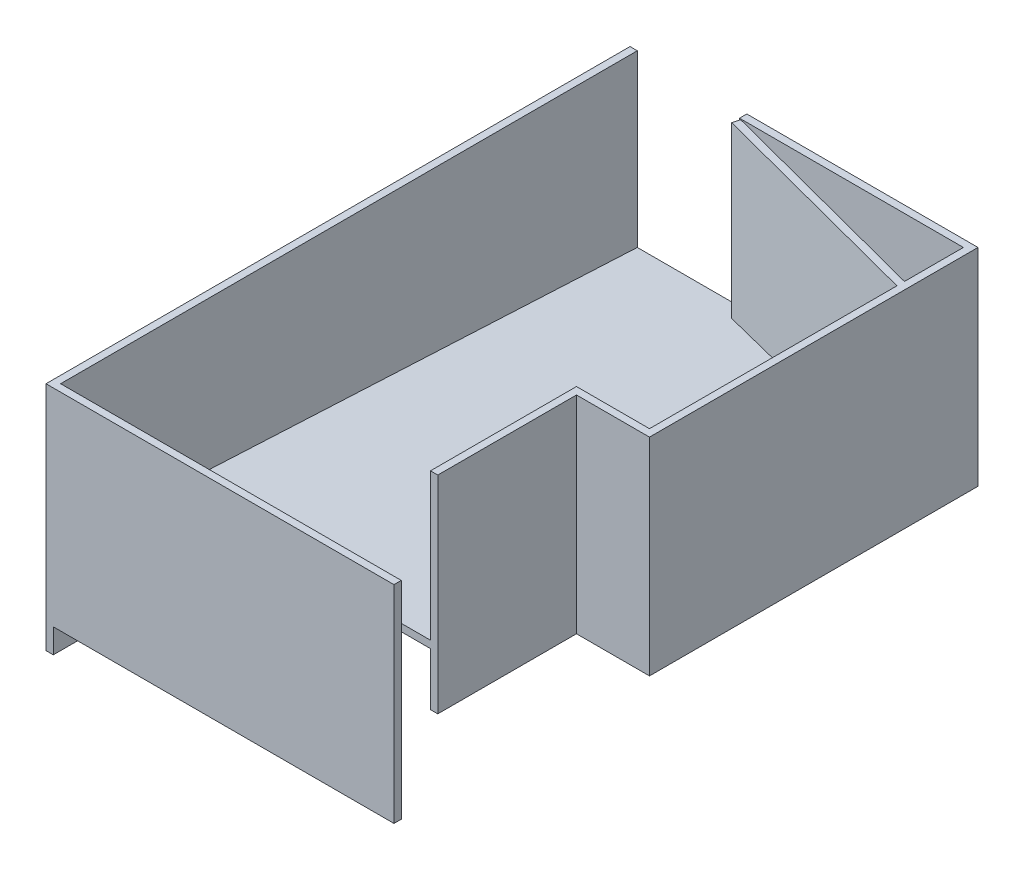
ISO-10303-21;
HEADER;
FILE_DESCRIPTION(('STEP AP214'),'2;1');
FILE_NAME('part.step','',(''),(''),'','','');
FILE_SCHEMA(('AUTOMOTIVE_DESIGN { 1 0 10303 214 1 1 1 1 }'));
ENDSEC;
DATA;
#1=APPLICATION_CONTEXT('core data for automotive mechanical design processes');
#2=APPLICATION_PROTOCOL_DEFINITION('international standard','automotive_design',2000,#1);
#3=PRODUCT_CONTEXT('',#1,'mechanical');
#4=PRODUCT('Part','Part','',(#3));
#5=PRODUCT_RELATED_PRODUCT_CATEGORY('part','',(#4));
#6=PRODUCT_DEFINITION_FORMATION('','',#4);
#7=PRODUCT_DEFINITION_CONTEXT('part definition',#1,'design');
#8=PRODUCT_DEFINITION('design','',#6,#7);
#9=PRODUCT_DEFINITION_SHAPE('','',#8);
#10=(LENGTH_UNIT() NAMED_UNIT(*) SI_UNIT(.MILLI.,.METRE.));
#11=(NAMED_UNIT(*) PLANE_ANGLE_UNIT() SI_UNIT($,.RADIAN.));
#12=(NAMED_UNIT(*) SI_UNIT($,.STERADIAN.) SOLID_ANGLE_UNIT());
#13=UNCERTAINTY_MEASURE_WITH_UNIT(LENGTH_MEASURE(1.E-05),#10,'distance_accuracy_value','');
#14=(GEOMETRIC_REPRESENTATION_CONTEXT(3) GLOBAL_UNCERTAINTY_ASSIGNED_CONTEXT((#13)) GLOBAL_UNIT_ASSIGNED_CONTEXT((#10,
#11,#12)) REPRESENTATION_CONTEXT('',''));
#15=CARTESIAN_POINT('',(0.,0.,0.));
#16=DIRECTION('',(0.,0.,1.));
#17=DIRECTION('',(1.,0.,0.));
#18=AXIS2_PLACEMENT_3D('',#15,#16,#17);
#19=CARTESIAN_POINT('',(0.,0.,0.));
#20=DIRECTION('',(0.,1.,0.));
#21=DIRECTION('',(0.,0.,-1.));
#22=AXIS2_PLACEMENT_3D('',#19,#20,#21);
#23=PLANE('',#22);
#24=DIRECTION('',(-1.,0.,0.));
#25=VECTOR('',#24,1.);
#26=CARTESIAN_POINT('',(0.,0.,-108.));
#27=LINE('',#26,#25);
#28=CARTESIAN_POINT('',(140.,0.,-108.));
#29=VERTEX_POINT('',#28);
#30=CARTESIAN_POINT('',(110.,0.,-108.));
#31=VERTEX_POINT('',#30);
#32=EDGE_CURVE('E286',#29,#31,#27,.T.);
#33=ORIENTED_EDGE('',*,*,#32,.F.);
#34=DIRECTION('',(0.,0.,1.));
#35=VECTOR('',#34,1.);
#36=CARTESIAN_POINT('',(140.,0.,0.));
#37=LINE('',#36,#35);
#38=CARTESIAN_POINT('',(140.,0.,-209.685010350037));
#39=VERTEX_POINT('',#38);
#40=EDGE_CURVE('E586',#39,#29,#37,.T.);
#41=ORIENTED_EDGE('',*,*,#40,.F.);
#42=DIRECTION('',(0.967321304204161,0.,0.253553730859481));
#43=VECTOR('',#42,1.);
#44=CARTESIAN_POINT('',(60.4295367429211,0.,-230.54197663142));
#45=LINE('',#44,#43);
#46=CARTESIAN_POINT('',(48.,0.,-233.8));
#47=VERTEX_POINT('',#46);
#48=EDGE_CURVE('E583',#47,#39,#45,.T.);
#49=ORIENTED_EDGE('',*,*,#48,.F.);
#50=DIRECTION('',(-0.25355373085948,0.,0.967321304204161));
#51=VECTOR('',#50,1.);
#52=CARTESIAN_POINT('',(-12.4295367429209,0.,-3.25802336858016));
#53=LINE('',#52,#51);
#54=CARTESIAN_POINT('',(48.7606611925784,0.,-236.701963912612));
#55=VERTEX_POINT('',#54);
#56=EDGE_CURVE('E580',#55,#47,#53,.T.);
#57=ORIENTED_EDGE('',*,*,#56,.F.);
#58=DIRECTION('',(-0.967321304204161,0.,-0.253553730859481));
#59=VECTOR('',#58,1.);
#60=CARTESIAN_POINT('',(61.1901979354996,0.,-233.443940544032));
#61=LINE('',#60,#59);
#62=CARTESIAN_POINT('',(140.,0.,-212.786358358151));
#63=VERTEX_POINT('',#62);
#64=EDGE_CURVE('E577',#63,#55,#61,.T.);
#65=ORIENTED_EDGE('',*,*,#64,.F.);
#66=DIRECTION('',(0.,0.,1.));
#67=VECTOR('',#66,1.);
#68=CARTESIAN_POINT('',(140.,0.,0.));
#69=LINE('',#68,#67);
#70=CARTESIAN_POINT('',(140.,0.,-237.));
#71=VERTEX_POINT('',#70);
#72=EDGE_CURVE('E570',#71,#63,#69,.T.);
#73=ORIENTED_EDGE('',*,*,#72,.F.);
#74=DIRECTION('',(1.,0.,0.));
#75=VECTOR('',#74,1.);
#76=CARTESIAN_POINT('',(0.,0.,-237.));
#77=LINE('',#76,#75);
#78=CARTESIAN_POINT('',(48.,0.,-237.));
#79=VERTEX_POINT('',#78);
#80=EDGE_CURVE('E566',#79,#71,#77,.T.);
#81=ORIENTED_EDGE('',*,*,#80,.F.);
#82=DIRECTION('',(0.,0.,1.));
#83=VECTOR('',#82,1.);
#84=CARTESIAN_POINT('',(48.,0.,0.));
#85=LINE('',#84,#83);
#86=CARTESIAN_POINT('',(48.,0.,-240.));
#87=VERTEX_POINT('',#86);
#88=EDGE_CURVE('E563',#87,#79,#85,.T.);
#89=ORIENTED_EDGE('',*,*,#88,.F.);
#90=DIRECTION('',(1.,0.,0.));
#91=VECTOR('',#90,1.);
#92=CARTESIAN_POINT('',(0.,0.,-240.));
#93=LINE('',#92,#91);
#94=CARTESIAN_POINT('',(143.,0.,-240.));
#95=VERTEX_POINT('',#94);
#96=EDGE_CURVE('E445',#87,#95,#93,.T.);
#97=ORIENTED_EDGE('',*,*,#96,.T.);
#98=DIRECTION('',(0.,0.,1.));
#99=VECTOR('',#98,1.);
#100=CARTESIAN_POINT('',(143.,0.,0.));
#101=LINE('',#100,#99);
#102=CARTESIAN_POINT('',(143.,0.,-105.));
#103=VERTEX_POINT('',#102);
#104=EDGE_CURVE('E472',#95,#103,#101,.T.);
#105=ORIENTED_EDGE('',*,*,#104,.T.);
#106=DIRECTION('',(1.,0.,0.));
#107=VECTOR('',#106,1.);
#108=CARTESIAN_POINT('',(113.,0.,-105.));
#109=LINE('',#108,#107);
#110=CARTESIAN_POINT('',(113.,0.,-105.));
#111=VERTEX_POINT('',#110);
#112=EDGE_CURVE('E302',#111,#103,#109,.T.);
#113=ORIENTED_EDGE('',*,*,#112,.F.);
#114=DIRECTION('',(0.,0.,-1.));
#115=VECTOR('',#114,1.);
#116=CARTESIAN_POINT('',(113.,0.,-48.));
#117=LINE('',#116,#115);
#118=CARTESIAN_POINT('',(113.,0.,-48.));
#119=VERTEX_POINT('',#118);
#120=EDGE_CURVE('E295',#119,#111,#117,.T.);
#121=ORIENTED_EDGE('',*,*,#120,.F.);
#122=DIRECTION('',(1.,0.,0.));
#123=VECTOR('',#122,1.);
#124=CARTESIAN_POINT('',(83.,0.,-48.));
#125=LINE('',#124,#123);
#126=CARTESIAN_POINT('',(110.,0.,-48.));
#127=VERTEX_POINT('',#126);
#128=EDGE_CURVE('E292',#127,#119,#125,.T.);
#129=ORIENTED_EDGE('',*,*,#128,.F.);
#130=DIRECTION('',(0.,0.,1.));
#131=VECTOR('',#130,1.);
#132=CARTESIAN_POINT('',(110.,0.,0.));
#133=LINE('',#132,#131);
#134=EDGE_CURVE('E568',#31,#127,#133,.T.);
#135=ORIENTED_EDGE('',*,*,#134,.F.);
#136=EDGE_LOOP('',(#33,#41,#49,#57,#65,#73,#81,#89,#97,#105,#113,#121,#129,#135));
#137=FACE_BOUND('',#136,.T.);
#138=ADVANCED_FACE('F37',(#137),#23,.F.);
#139=DIRECTION('',(-1.,0.,0.));
#140=VECTOR('',#139,1.);
#141=CARTESIAN_POINT('',(110.,0.,-2.99999999999999));
#142=LINE('',#141,#140);
#143=CARTESIAN_POINT('',(143.,0.,-2.99999999999999));
#144=VERTEX_POINT('',#143);
#145=CARTESIAN_POINT('',(3.,0.,-3.));
#146=VERTEX_POINT('',#145);
#147=EDGE_CURVE('E283',#144,#146,#142,.T.);
#148=ORIENTED_EDGE('',*,*,#147,.F.);
#149=CARTESIAN_POINT('',(143.,0.,0.));
#150=VERTEX_POINT('',#149);
#151=EDGE_CURVE('E471',#144,#150,#101,.T.);
#152=ORIENTED_EDGE('',*,*,#151,.T.);
#153=DIRECTION('',(-1.,0.,0.));
#154=VECTOR('',#153,1.);
#155=CARTESIAN_POINT('',(0.,0.,0.));
#156=LINE('',#155,#154);
#157=CARTESIAN_POINT('',(3.00000000000003,0.,0.));
#158=VERTEX_POINT('',#157);
#159=EDGE_CURVE('E284',#150,#158,#156,.T.);
#160=ORIENTED_EDGE('',*,*,#159,.T.);
#161=DIRECTION('',(0.,0.,-1.));
#162=VECTOR('',#161,1.);
#163=CARTESIAN_POINT('',(3.00000000000003,0.,0.));
#164=LINE('',#163,#162);
#165=EDGE_CURVE('E268',#158,#146,#164,.T.);
#166=ORIENTED_EDGE('',*,*,#165,.T.);
#167=EDGE_LOOP('',(#148,#152,#160,#166));
#168=FACE_BOUND('',#167,.T.);
#169=ADVANCED_FACE('F281',(#168),#23,.F.);
#170=CARTESIAN_POINT('',(143.,85.,0.));
#171=DIRECTION('',(-1.,0.,0.));
#172=DIRECTION('',(0.,0.,-1.));
#173=AXIS2_PLACEMENT_3D('',#170,#171,#172);
#174=PLANE('',#173);
#175=DIRECTION('',(0.,-1.,0.));
#176=VECTOR('',#175,1.);
#177=CARTESIAN_POINT('',(143.,3.,-2.99999999999999));
#178=LINE('',#177,#176);
#179=CARTESIAN_POINT('',(143.,85.,-3.));
#180=VERTEX_POINT('',#179);
#181=EDGE_CURVE('E290',#180,#144,#178,.T.);
#182=ORIENTED_EDGE('',*,*,#181,.F.);
#183=DIRECTION('',(0.,0.,1.));
#184=VECTOR('',#183,1.);
#185=CARTESIAN_POINT('',(143.,85.,0.));
#186=LINE('',#185,#184);
#187=CARTESIAN_POINT('',(143.,85.,0.));
#188=VERTEX_POINT('',#187);
#189=EDGE_CURVE('E461',#180,#188,#186,.T.);
#190=ORIENTED_EDGE('',*,*,#189,.T.);
#191=DIRECTION('',(0.,-1.,0.));
#192=VECTOR('',#191,1.);
#193=CARTESIAN_POINT('',(143.,85.,0.));
#194=LINE('',#193,#192);
#195=EDGE_CURVE('E478',#188,#150,#194,.T.);
#196=ORIENTED_EDGE('',*,*,#195,.T.);
#197=ORIENTED_EDGE('',*,*,#151,.F.);
#198=EDGE_LOOP('',(#182,#190,#196,#197));
#199=FACE_BOUND('',#198,.T.);
#200=ADVANCED_FACE('F611',(#199),#174,.F.);
#201=CARTESIAN_POINT('',(377.474451903884,11.9961569239648,-240.));
#202=DIRECTION('',(0.,0.99872061358136,-0.0505681323332335));
#203=DIRECTION('',(0.,-0.0505681323332336,-0.99872061358136));
#204=AXIS2_PLACEMENT_3D('',#201,#202,#203);
#205=PLANE('',#204);
#206=DIRECTION('',(0.,-0.0505681323332336,-0.99872061358136));
#207=VECTOR('',#206,1.);
#208=CARTESIAN_POINT('',(83.0000000000001,11.9961569239648,-240.));
#209=LINE('',#208,#207);
#210=CARTESIAN_POINT('',(83.,23.9961569239648,-2.99999999999999));
#211=VERTEX_POINT('',#210);
#212=CARTESIAN_POINT('',(83.0000000000001,21.7176759113066,-48.));
#213=VERTEX_POINT('',#212);
#214=EDGE_CURVE('E321',#211,#213,#209,.T.);
#215=ORIENTED_EDGE('',*,*,#214,.F.);
#216=DIRECTION('',(-1.,0.,0.));
#217=VECTOR('',#216,1.);
#218=CARTESIAN_POINT('',(377.474451903884,23.9961569239648,-2.99999999999997));
#219=LINE('',#218,#217);
#220=CARTESIAN_POINT('',(3.,23.9961569239648,-3.00000000000002));
#221=VERTEX_POINT('',#220);
#222=EDGE_CURVE('E427',#211,#221,#219,.T.);
#223=ORIENTED_EDGE('',*,*,#222,.T.);
#224=DIRECTION('',(0.,0.0505681323332336,0.99872061358136));
#225=VECTOR('',#224,1.);
#226=CARTESIAN_POINT('',(3.00000000000003,11.9961569239648,-240.));
#227=LINE('',#226,#225);
#228=CARTESIAN_POINT('',(3.00000000000003,11.9961569239648,-240.));
#229=VERTEX_POINT('',#228);
#230=EDGE_CURVE('E271',#229,#221,#227,.T.);
#231=ORIENTED_EDGE('',*,*,#230,.F.);
#232=DIRECTION('',(-1.,0.,0.));
#233=VECTOR('',#232,1.);
#234=CARTESIAN_POINT('',(377.474451903884,11.9961569239648,-240.));
#235=LINE('',#234,#233);
#236=CARTESIAN_POINT('',(48.,11.9961569239648,-240.));
#237=VERTEX_POINT('',#236);
#238=EDGE_CURVE('E429',#237,#229,#235,.T.);
#239=ORIENTED_EDGE('',*,*,#238,.F.);
#240=DIRECTION('',(0.,0.0505681323332336,0.99872061358136));
#241=VECTOR('',#240,1.);
#242=CARTESIAN_POINT('',(48.,11.9961569239648,-240.));
#243=LINE('',#242,#241);
#244=CARTESIAN_POINT('',(48.,12.148055658142,-237.));
#245=VERTEX_POINT('',#244);
#246=EDGE_CURVE('E382',#237,#245,#243,.T.);
#247=ORIENTED_EDGE('',*,*,#246,.T.);
#248=DIRECTION('',(1.,0.,0.));
#249=VECTOR('',#248,1.);
#250=CARTESIAN_POINT('',(377.474451903884,12.148055658142,-237.));
#251=LINE('',#250,#249);
#252=CARTESIAN_POINT('',(140.,12.148055658142,-237.));
#253=VERTEX_POINT('',#252);
#254=EDGE_CURVE('E376',#245,#253,#251,.T.);
#255=ORIENTED_EDGE('',*,*,#254,.T.);
#256=DIRECTION('',(0.,-0.0505681323332336,-0.99872061358136));
#257=VECTOR('',#256,1.);
#258=CARTESIAN_POINT('',(140.,11.9961569239648,-240.));
#259=LINE('',#258,#257);
#260=CARTESIAN_POINT('',(140.,13.3740628298812,-212.786358358151));
#261=VERTEX_POINT('',#260);
#262=EDGE_CURVE('E438',#261,#253,#259,.T.);
#263=ORIENTED_EDGE('',*,*,#262,.F.);
#264=DIRECTION('',(-0.96724159786058,-0.0128371057355101,-0.253532838276323));
#265=VECTOR('',#264,1.);
#266=CARTESIAN_POINT('',(355.480079222322,16.2338866494847,-156.304837920982));
#267=LINE('',#266,#265);
#268=CARTESIAN_POINT('',(48.7606611925784,12.1631460929465,-236.701963912612));
#269=VERTEX_POINT('',#268);
#270=EDGE_CURVE('E401',#261,#269,#267,.T.);
#271=ORIENTED_EDGE('',*,*,#270,.T.);
#272=DIRECTION('',(-0.253250155295948,0.0489196530066668,0.966163146881667));
#273=VECTOR('',#272,1.);
#274=CARTESIAN_POINT('',(70.6519663899,7.93446140422614,-320.218486514838));
#275=LINE('',#274,#273);
#276=CARTESIAN_POINT('',(47.9999999999999,12.3100809745977,-233.8));
#277=VERTEX_POINT('',#276);
#278=EDGE_CURVE('E406',#269,#277,#275,.T.);
#279=ORIENTED_EDGE('',*,*,#278,.T.);
#280=DIRECTION('',(0.96724159786058,0.0128371057355101,0.253532838276323));
#281=VECTOR('',#280,1.);
#282=CARTESIAN_POINT('',(354.717593600639,16.3807973175482,-153.403352226728));
#283=LINE('',#282,#281);
#284=CARTESIAN_POINT('',(140.,13.5310931087731,-209.685010350037));
#285=VERTEX_POINT('',#284);
#286=EDGE_CURVE('E412',#277,#285,#283,.T.);
#287=ORIENTED_EDGE('',*,*,#286,.T.);
#288=CARTESIAN_POINT('',(140.,18.6797012277623,-108.));
#289=VERTEX_POINT('',#288);
#290=EDGE_CURVE('E439',#289,#285,#259,.T.);
#291=ORIENTED_EDGE('',*,*,#290,.F.);
#292=DIRECTION('',(-1.,0.,0.));
#293=VECTOR('',#292,1.);
#294=CARTESIAN_POINT('',(377.474451903884,18.6797012277623,-108.));
#295=LINE('',#294,#293);
#296=CARTESIAN_POINT('',(110.,18.6797012277623,-108.));
#297=VERTEX_POINT('',#296);
#298=EDGE_CURVE('E353',#289,#297,#295,.T.);
#299=ORIENTED_EDGE('',*,*,#298,.T.);
#300=DIRECTION('',(0.,0.0505681323332336,0.99872061358136));
#301=VECTOR('',#300,1.);
#302=CARTESIAN_POINT('',(110.,11.9961569239648,-240.));
#303=LINE('',#302,#301);
#304=CARTESIAN_POINT('',(110.,21.7176759113066,-48.));
#305=VERTEX_POINT('',#304);
#306=EDGE_CURVE('E356',#297,#305,#303,.T.);
#307=ORIENTED_EDGE('',*,*,#306,.T.);
#308=DIRECTION('',(1.,0.,0.));
#309=VECTOR('',#308,1.);
#310=CARTESIAN_POINT('',(377.474451903884,21.7176759113066,-48.));
#311=LINE('',#310,#309);
#312=EDGE_CURVE('E313',#213,#305,#311,.T.);
#313=ORIENTED_EDGE('',*,*,#312,.F.);
#314=EDGE_LOOP('',(#215,#223,#231,#239,#247,#255,#263,#271,#279,#287,#291,#299,#307,#313));
#315=FACE_BOUND('',#314,.T.);
#316=ADVANCED_FACE('F637',(#315),#205,.F.);
#317=CARTESIAN_POINT('',(377.474451903884,27.,-2.99999999999998));
#318=DIRECTION('',(0.,-0.99872061358136,0.0505681323332334));
#319=DIRECTION('',(0.,0.0505681323332335,0.99872061358136));
#320=AXIS2_PLACEMENT_3D('',#317,#318,#319);
#321=PLANE('',#320);
#322=DIRECTION('',(0.,-0.0505681323332335,-0.99872061358136));
#323=VECTOR('',#322,1.);
#324=CARTESIAN_POINT('',(110.,27.,-2.99999999999998));
#325=LINE('',#324,#323);
#326=CARTESIAN_POINT('',(110.,24.7215189873418,-48.));
#327=VERTEX_POINT('',#326);
#328=CARTESIAN_POINT('',(110.,21.6835443037975,-108.));
#329=VERTEX_POINT('',#328);
#330=EDGE_CURVE('E11',#327,#329,#325,.T.);
#331=ORIENTED_EDGE('',*,*,#330,.T.);
#332=DIRECTION('',(1.,0.,0.));
#333=VECTOR('',#332,1.);
#334=CARTESIAN_POINT('',(377.474451903884,21.6835443037975,-108.));
#335=LINE('',#334,#333);
#336=CARTESIAN_POINT('',(140.,21.6835443037975,-108.));
#337=VERTEX_POINT('',#336);
#338=EDGE_CURVE('E348',#329,#337,#335,.T.);
#339=ORIENTED_EDGE('',*,*,#338,.T.);
#340=DIRECTION('',(0.,0.0505681323332335,0.99872061358136));
#341=VECTOR('',#340,1.);
#342=CARTESIAN_POINT('',(140.,27.,-3.00000000000001));
#343=LINE('',#342,#341);
#344=CARTESIAN_POINT('',(140.,16.5349361848083,-209.685010350037));
#345=VERTEX_POINT('',#344);
#346=EDGE_CURVE('E423',#345,#337,#343,.T.);
#347=ORIENTED_EDGE('',*,*,#346,.F.);
#348=DIRECTION('',(-0.96724159786058,-0.01283710573551,-0.253532838276323));
#349=VECTOR('',#348,1.);
#350=CARTESIAN_POINT('',(412.985511894873,20.1579646900008,-138.130197372485));
#351=LINE('',#350,#349);
#352=CARTESIAN_POINT('',(47.9999999999999,15.3139240506329,-233.8));
#353=VERTEX_POINT('',#352);
#354=EDGE_CURVE('E45',#345,#353,#351,.T.);
#355=ORIENTED_EDGE('',*,*,#354,.T.);
#356=DIRECTION('',(0.253250155295948,-0.0489196530066667,-0.966163146881667));
#357=VECTOR('',#356,1.);
#358=CARTESIAN_POINT('',(12.5139102968546,22.1686767863723,-98.4186334691473));
#359=LINE('',#358,#357);
#360=CARTESIAN_POINT('',(48.7606611925785,15.1669891689816,-236.701963912612));
#361=VERTEX_POINT('',#360);
#362=EDGE_CURVE('E488',#353,#361,#359,.T.);
#363=ORIENTED_EDGE('',*,*,#362,.T.);
#364=DIRECTION('',(0.96724159786058,0.01283710573551,0.253532838276323));
#365=VECTOR('',#364,1.);
#366=CARTESIAN_POINT('',(413.747997516555,20.0110540219373,-141.031683066739));
#367=LINE('',#366,#365);
#368=CARTESIAN_POINT('',(140.,16.3779059059164,-212.786358358151));
#369=VERTEX_POINT('',#368);
#370=EDGE_CURVE('E485',#361,#369,#367,.T.);
#371=ORIENTED_EDGE('',*,*,#370,.T.);
#372=CARTESIAN_POINT('',(140.,15.1518987341772,-237.));
#373=VERTEX_POINT('',#372);
#374=EDGE_CURVE('E419',#373,#369,#343,.T.);
#375=ORIENTED_EDGE('',*,*,#374,.F.);
#376=DIRECTION('',(-1.,0.,0.));
#377=VECTOR('',#376,1.);
#378=CARTESIAN_POINT('',(377.474451903884,15.1518987341772,-237.));
#379=LINE('',#378,#377);
#380=CARTESIAN_POINT('',(48.,15.1518987341772,-237.));
#381=VERTEX_POINT('',#380);
#382=EDGE_CURVE('E363',#373,#381,#379,.T.);
#383=ORIENTED_EDGE('',*,*,#382,.T.);
#384=DIRECTION('',(0.,-0.0505681323332335,-0.99872061358136));
#385=VECTOR('',#384,1.);
#386=CARTESIAN_POINT('',(48.,27.,-2.99999999999998));
#387=LINE('',#386,#385);
#388=CARTESIAN_POINT('',(48.,15.,-240.));
#389=VERTEX_POINT('',#388);
#390=EDGE_CURVE('E379',#381,#389,#387,.T.);
#391=ORIENTED_EDGE('',*,*,#390,.T.);
#392=DIRECTION('',(-1.,0.,0.));
#393=VECTOR('',#392,1.);
#394=CARTESIAN_POINT('',(377.474451903884,15.,-240.));
#395=LINE('',#394,#393);
#396=CARTESIAN_POINT('',(3.00000000000003,15.,-240.));
#397=VERTEX_POINT('',#396);
#398=EDGE_CURVE('E432',#389,#397,#395,.T.);
#399=ORIENTED_EDGE('',*,*,#398,.T.);
#400=DIRECTION('',(0.,-0.0505681323332334,-0.99872061358136));
#401=VECTOR('',#400,1.);
#402=CARTESIAN_POINT('',(3.,27.,-3.00000000000003));
#403=LINE('',#402,#401);
#404=CARTESIAN_POINT('',(3.,27.,-3.00000000000003));
#405=VERTEX_POINT('',#404);
#406=EDGE_CURVE('E418',#405,#397,#403,.T.);
#407=ORIENTED_EDGE('',*,*,#406,.F.);
#408=DIRECTION('',(-1.,0.,0.));
#409=VECTOR('',#408,1.);
#410=CARTESIAN_POINT('',(377.474451903884,27.,-2.99999999999998));
#411=LINE('',#410,#409);
#412=CARTESIAN_POINT('',(83.,27.,-2.99999999999999));
#413=VERTEX_POINT('',#412);
#414=EDGE_CURVE('E435',#413,#405,#411,.T.);
#415=ORIENTED_EDGE('',*,*,#414,.F.);
#416=DIRECTION('',(0.,0.0505681323332335,0.99872061358136));
#417=VECTOR('',#416,1.);
#418=CARTESIAN_POINT('',(83.0000000000001,27.,-2.99999999999998));
#419=LINE('',#418,#417);
#420=CARTESIAN_POINT('',(83.0000000000001,24.7215189873418,-48.));
#421=VERTEX_POINT('',#420);
#422=EDGE_CURVE('E316',#421,#413,#419,.T.);
#423=ORIENTED_EDGE('',*,*,#422,.F.);
#424=DIRECTION('',(-1.,0.,0.));
#425=VECTOR('',#424,1.);
#426=CARTESIAN_POINT('',(377.474451903884,24.7215189873418,-48.));
#427=LINE('',#426,#425);
#428=EDGE_CURVE('E309',#327,#421,#427,.T.);
#429=ORIENTED_EDGE('',*,*,#428,.F.);
#430=EDGE_LOOP('',(#331,#339,#347,#355,#363,#371,#375,#383,#391,#399,#407,#415,#423,#429));
#431=FACE_BOUND('',#430,.T.);
#432=ADVANCED_FACE('F494',(#431),#321,.F.);
#433=CARTESIAN_POINT('',(140.,85.,0.));
#434=DIRECTION('',(-1.,0.,0.));
#435=DIRECTION('',(0.,0.,-1.));
#436=AXIS2_PLACEMENT_3D('',#433,#434,#435);
#437=PLANE('',#436);
#438=ORIENTED_EDGE('',*,*,#290,.T.);
#439=DIRECTION('',(0.,1.,0.));
#440=VECTOR('',#439,1.);
#441=CARTESIAN_POINT('',(140.,85.,-209.685010350037));
#442=LINE('',#441,#440);
#443=EDGE_CURVE('E415',#39,#285,#442,.T.);
#444=ORIENTED_EDGE('',*,*,#443,.F.);
#445=ORIENTED_EDGE('',*,*,#40,.T.);
#446=DIRECTION('',(0.,-1.,0.));
#447=VECTOR('',#446,1.);
#448=CARTESIAN_POINT('',(140.,85.,-108.));
#449=LINE('',#448,#447);
#450=EDGE_CURVE('E351',#289,#29,#449,.T.);
#451=ORIENTED_EDGE('',*,*,#450,.F.);
#452=EDGE_LOOP('',(#438,#444,#445,#451));
#453=FACE_BOUND('',#452,.T.);
#454=ADVANCED_FACE('F629',(#453),#437,.T.);
#455=DIRECTION('',(0.,0.,1.));
#456=VECTOR('',#455,1.);
#457=CARTESIAN_POINT('',(140.,85.,0.));
#458=LINE('',#457,#456);
#459=CARTESIAN_POINT('',(140.,85.,-209.685010350037));
#460=VERTEX_POINT('',#459);
#461=CARTESIAN_POINT('',(140.,85.,-108.));
#462=VERTEX_POINT('',#461);
#463=EDGE_CURVE('E449',#460,#462,#458,.T.);
#464=ORIENTED_EDGE('',*,*,#463,.F.);
#465=DIRECTION('',(0.,1.,0.));
#466=VECTOR('',#465,1.);
#467=CARTESIAN_POINT('',(140.,85.,-209.685010350037));
#468=LINE('',#467,#466);
#469=EDGE_CURVE('E409',#345,#460,#468,.T.);
#470=ORIENTED_EDGE('',*,*,#469,.F.);
#471=ORIENTED_EDGE('',*,*,#346,.T.);
#472=DIRECTION('',(0.,-1.,0.));
#473=VECTOR('',#472,1.);
#474=CARTESIAN_POINT('',(140.,85.,-108.));
#475=LINE('',#474,#473);
#476=EDGE_CURVE('E327',#462,#337,#475,.T.);
#477=ORIENTED_EDGE('',*,*,#476,.F.);
#478=EDGE_LOOP('',(#464,#470,#471,#477));
#479=FACE_BOUND('',#478,.T.);
#480=ADVANCED_FACE('F548',(#479),#437,.T.);
#481=DIRECTION('',(0.,-1.,0.));
#482=VECTOR('',#481,1.);
#483=CARTESIAN_POINT('',(140.,85.,-212.786358358151));
#484=LINE('',#483,#482);
#485=EDGE_CURVE('E404',#261,#63,#484,.T.);
#486=ORIENTED_EDGE('',*,*,#485,.F.);
#487=ORIENTED_EDGE('',*,*,#262,.T.);
#488=DIRECTION('',(0.,-1.,0.));
#489=VECTOR('',#488,1.);
#490=CARTESIAN_POINT('',(140.,183.984969332527,-237.));
#491=LINE('',#490,#489);
#492=EDGE_CURVE('E370',#253,#71,#491,.T.);
#493=ORIENTED_EDGE('',*,*,#492,.T.);
#494=ORIENTED_EDGE('',*,*,#72,.T.);
#495=EDGE_LOOP('',(#486,#487,#493,#494));
#496=FACE_BOUND('',#495,.T.);
#497=ADVANCED_FACE('F856',(#496),#437,.T.);
#498=ORIENTED_EDGE('',*,*,#374,.T.);
#499=DIRECTION('',(0.,-1.,0.));
#500=VECTOR('',#499,1.);
#501=CARTESIAN_POINT('',(140.,85.,-212.786358358151));
#502=LINE('',#501,#500);
#503=CARTESIAN_POINT('',(140.,85.,-212.786358358151));
#504=VERTEX_POINT('',#503);
#505=EDGE_CURVE('E389',#504,#369,#502,.T.);
#506=ORIENTED_EDGE('',*,*,#505,.F.);
#507=CARTESIAN_POINT('',(140.,85.,-237.));
#508=VERTEX_POINT('',#507);
#509=EDGE_CURVE('E446',#508,#504,#458,.T.);
#510=ORIENTED_EDGE('',*,*,#509,.F.);
#511=EDGE_CURVE('E367',#508,#373,#491,.T.);
#512=ORIENTED_EDGE('',*,*,#511,.T.);
#513=EDGE_LOOP('',(#498,#506,#510,#512));
#514=FACE_BOUND('',#513,.T.);
#515=ADVANCED_FACE('F511',(#514),#437,.T.);
#516=CARTESIAN_POINT('',(0.,85.,0.));
#517=DIRECTION('',(0.,1.,0.));
#518=DIRECTION('',(0.,0.,-1.));
#519=AXIS2_PLACEMENT_3D('',#516,#517,#518);
#520=PLANE('',#519);
#521=DIRECTION('',(-1.,0.,0.));
#522=VECTOR('',#521,1.);
#523=CARTESIAN_POINT('',(0.,85.,-3.));
#524=LINE('',#523,#522);
#525=CARTESIAN_POINT('',(3.,85.,-3.));
#526=VERTEX_POINT('',#525);
#527=EDGE_CURVE('E277',#180,#526,#524,.T.);
#528=ORIENTED_EDGE('',*,*,#527,.T.);
#529=DIRECTION('',(0.,0.,-1.));
#530=VECTOR('',#529,1.);
#531=CARTESIAN_POINT('',(3.,85.,0.));
#532=LINE('',#531,#530);
#533=CARTESIAN_POINT('',(3.00000000000003,85.,-240.));
#534=VERTEX_POINT('',#533);
#535=EDGE_CURVE('E422',#526,#534,#532,.T.);
#536=ORIENTED_EDGE('',*,*,#535,.T.);
#537=DIRECTION('',(1.,0.,0.));
#538=VECTOR('',#537,1.);
#539=CARTESIAN_POINT('',(0.,85.,-240.));
#540=LINE('',#539,#538);
#541=CARTESIAN_POINT('',(0.,85.,-240.));
#542=VERTEX_POINT('',#541);
#543=EDGE_CURVE('E458',#542,#534,#540,.T.);
#544=ORIENTED_EDGE('',*,*,#543,.F.);
#545=DIRECTION('',(0.,0.,-1.));
#546=VECTOR('',#545,1.);
#547=CARTESIAN_POINT('',(0.,85.,0.));
#548=LINE('',#547,#546);
#549=CARTESIAN_POINT('',(0.,85.,0.));
#550=VERTEX_POINT('',#549);
#551=EDGE_CURVE('E454',#550,#542,#548,.T.);
#552=ORIENTED_EDGE('',*,*,#551,.F.);
#553=DIRECTION('',(-1.,0.,0.));
#554=VECTOR('',#553,1.);
#555=CARTESIAN_POINT('',(0.,85.,0.));
#556=LINE('',#555,#554);
#557=EDGE_CURVE('E465',#188,#550,#556,.T.);
#558=ORIENTED_EDGE('',*,*,#557,.F.);
#559=ORIENTED_EDGE('',*,*,#189,.F.);
#560=EDGE_LOOP('',(#528,#536,#544,#552,#558,#559));
#561=FACE_BOUND('',#560,.T.);
#562=ADVANCED_FACE('F606',(#561),#520,.T.);
#563=CARTESIAN_POINT('',(3.,85.,0.));
#564=DIRECTION('',(1.,0.,0.));
#565=DIRECTION('',(0.,0.,1.));
#566=AXIS2_PLACEMENT_3D('',#563,#564,#565);
#567=PLANE('',#566);
#568=DIRECTION('',(0.,-1.,0.));
#569=VECTOR('',#568,1.);
#570=CARTESIAN_POINT('',(3.,85.,-3.));
#571=LINE('',#570,#569);
#572=EDGE_CURVE('E265',#221,#146,#571,.T.);
#573=ORIENTED_EDGE('',*,*,#572,.T.);
#574=ORIENTED_EDGE('',*,*,#165,.F.);
#575=DIRECTION('',(0.,1.,0.));
#576=VECTOR('',#575,1.);
#577=CARTESIAN_POINT('',(3.00000000000003,-10.,0.));
#578=LINE('',#577,#576);
#579=CARTESIAN_POINT('',(3.00000000000003,-10.,0.));
#580=VERTEX_POINT('',#579);
#581=EDGE_CURVE('E52',#580,#158,#578,.T.);
#582=ORIENTED_EDGE('',*,*,#581,.F.);
#583=DIRECTION('',(0.,0.,-1.));
#584=VECTOR('',#583,1.);
#585=CARTESIAN_POINT('',(3.00000000000003,-10.,0.));
#586=LINE('',#585,#584);
#587=CARTESIAN_POINT('',(3.00000000000003,-10.,-240.));
#588=VERTEX_POINT('',#587);
#589=EDGE_CURVE('E595',#580,#588,#586,.T.);
#590=ORIENTED_EDGE('',*,*,#589,.T.);
#591=DIRECTION('',(0.,-1.,0.));
#592=VECTOR('',#591,1.);
#593=CARTESIAN_POINT('',(3.00000000000003,85.,-240.));
#594=LINE('',#593,#592);
#595=EDGE_CURVE('E442',#229,#588,#594,.T.);
#596=ORIENTED_EDGE('',*,*,#595,.F.);
#597=ORIENTED_EDGE('',*,*,#230,.T.);
#598=EDGE_LOOP('',(#573,#574,#582,#590,#596,#597));
#599=FACE_BOUND('',#598,.T.);
#600=ADVANCED_FACE('F267',(#599),#567,.T.);
#601=EDGE_CURVE('E443',#534,#397,#594,.T.);
#602=ORIENTED_EDGE('',*,*,#601,.F.);
#603=ORIENTED_EDGE('',*,*,#535,.F.);
#604=EDGE_CURVE('E276',#526,#405,#571,.T.);
#605=ORIENTED_EDGE('',*,*,#604,.T.);
#606=ORIENTED_EDGE('',*,*,#406,.T.);
#607=EDGE_LOOP('',(#602,#603,#605,#606));
#608=FACE_BOUND('',#607,.T.);
#609=ADVANCED_FACE('F530',(#608),#567,.T.);
#610=CARTESIAN_POINT('',(0.,85.,-3.));
#611=DIRECTION('',(0.,0.,-1.));
#612=DIRECTION('',(1.,0.,0.));
#613=AXIS2_PLACEMENT_3D('',#610,#611,#612);
#614=PLANE('',#613);
#615=ORIENTED_EDGE('',*,*,#572,.F.);
#616=ORIENTED_EDGE('',*,*,#222,.F.);
#617=DIRECTION('',(0.,1.,0.));
#618=VECTOR('',#617,1.);
#619=CARTESIAN_POINT('',(83.,0.,-2.99999999999999));
#620=LINE('',#619,#618);
#621=EDGE_CURVE('E305',#211,#413,#620,.T.);
#622=ORIENTED_EDGE('',*,*,#621,.T.);
#623=ORIENTED_EDGE('',*,*,#414,.T.);
#624=ORIENTED_EDGE('',*,*,#604,.F.);
#625=ORIENTED_EDGE('',*,*,#527,.F.);
#626=ORIENTED_EDGE('',*,*,#181,.T.);
#627=ORIENTED_EDGE('',*,*,#147,.T.);
#628=EDGE_LOOP('',(#615,#616,#622,#623,#624,#625,#626,#627));
#629=FACE_BOUND('',#628,.T.);
#630=ADVANCED_FACE('F288',(#629),#614,.T.);
#631=CARTESIAN_POINT('',(0.,85.,0.));
#632=DIRECTION('',(1.,0.,0.));
#633=DIRECTION('',(0.,0.,1.));
#634=AXIS2_PLACEMENT_3D('',#631,#632,#633);
#635=PLANE('',#634);
#636=DIRECTION('',(0.,-1.,0.));
#637=VECTOR('',#636,1.);
#638=CARTESIAN_POINT('',(0.,85.,0.));
#639=LINE('',#638,#637);
#640=CARTESIAN_POINT('',(0.,-10.,0.));
#641=VERTEX_POINT('',#640);
#642=EDGE_CURVE('E468',#550,#641,#639,.T.);
#643=ORIENTED_EDGE('',*,*,#642,.F.);
#644=ORIENTED_EDGE('',*,*,#551,.T.);
#645=DIRECTION('',(0.,-1.,0.));
#646=VECTOR('',#645,1.);
#647=CARTESIAN_POINT('',(0.,85.,-240.));
#648=LINE('',#647,#646);
#649=CARTESIAN_POINT('',(0.,-10.,-240.));
#650=VERTEX_POINT('',#649);
#651=EDGE_CURVE('E482',#542,#650,#648,.T.);
#652=ORIENTED_EDGE('',*,*,#651,.T.);
#653=DIRECTION('',(0.,0.,1.));
#654=VECTOR('',#653,1.);
#655=CARTESIAN_POINT('',(0.,-10.,0.));
#656=LINE('',#655,#654);
#657=EDGE_CURVE('E285',#650,#641,#656,.T.);
#658=ORIENTED_EDGE('',*,*,#657,.T.);
#659=EDGE_LOOP('',(#643,#644,#652,#658));
#660=FACE_BOUND('',#659,.T.);
#661=ADVANCED_FACE('F39',(#660),#635,.F.);
#662=CARTESIAN_POINT('',(0.,85.,-240.));
#663=DIRECTION('',(0.,0.,1.));
#664=DIRECTION('',(-1.,0.,0.));
#665=AXIS2_PLACEMENT_3D('',#662,#663,#664);
#666=PLANE('',#665);
#667=DIRECTION('',(0.,-1.,0.));
#668=VECTOR('',#667,1.);
#669=CARTESIAN_POINT('',(48.,183.984969332527,-240.));
#670=LINE('',#669,#668);
#671=EDGE_CURVE('E359',#237,#87,#670,.T.);
#672=ORIENTED_EDGE('',*,*,#671,.F.);
#673=ORIENTED_EDGE('',*,*,#238,.T.);
#674=ORIENTED_EDGE('',*,*,#595,.T.);
#675=DIRECTION('',(-1.,0.,0.));
#676=VECTOR('',#675,1.);
#677=CARTESIAN_POINT('',(0.,-10.,-240.));
#678=LINE('',#677,#676);
#679=EDGE_CURVE('E297',#588,#650,#678,.T.);
#680=ORIENTED_EDGE('',*,*,#679,.T.);
#681=ORIENTED_EDGE('',*,*,#651,.F.);
#682=ORIENTED_EDGE('',*,*,#543,.T.);
#683=ORIENTED_EDGE('',*,*,#601,.T.);
#684=ORIENTED_EDGE('',*,*,#398,.F.);
#685=CARTESIAN_POINT('',(48.,85.,-240.));
#686=VERTEX_POINT('',#685);
#687=EDGE_CURVE('E372',#686,#389,#670,.T.);
#688=ORIENTED_EDGE('',*,*,#687,.F.);
#689=CARTESIAN_POINT('',(143.,85.,-240.));
#690=VERTEX_POINT('',#689);
#691=EDGE_CURVE('E457',#686,#690,#540,.T.);
#692=ORIENTED_EDGE('',*,*,#691,.T.);
#693=DIRECTION('',(0.,-1.,0.));
#694=VECTOR('',#693,1.);
#695=CARTESIAN_POINT('',(143.,85.,-240.));
#696=LINE('',#695,#694);
#697=EDGE_CURVE('E480',#690,#95,#696,.T.);
#698=ORIENTED_EDGE('',*,*,#697,.T.);
#699=ORIENTED_EDGE('',*,*,#96,.F.);
#700=EDGE_LOOP('',(#672,#673,#674,#680,#681,#682,#683,#684,#688,#692,#698,#699));
#701=FACE_BOUND('',#700,.T.);
#702=ADVANCED_FACE('F525',(#701),#666,.F.);
#703=ORIENTED_EDGE('',*,*,#104,.F.);
#704=ORIENTED_EDGE('',*,*,#697,.F.);
#705=CARTESIAN_POINT('',(143.,85.,-105.));
#706=VERTEX_POINT('',#705);
#707=EDGE_CURVE('E462',#690,#706,#186,.T.);
#708=ORIENTED_EDGE('',*,*,#707,.T.);
#709=DIRECTION('',(0.,1.,0.));
#710=VECTOR('',#709,1.);
#711=CARTESIAN_POINT('',(143.,0.,-105.));
#712=LINE('',#711,#710);
#713=EDGE_CURVE('E306',#103,#706,#712,.T.);
#714=ORIENTED_EDGE('',*,*,#713,.F.);
#715=EDGE_LOOP('',(#703,#704,#708,#714));
#716=FACE_BOUND('',#715,.T.);
#717=ADVANCED_FACE('F557',(#716),#174,.F.);
#718=CARTESIAN_POINT('',(0.,85.,0.));
#719=DIRECTION('',(0.,0.,-1.));
#720=DIRECTION('',(1.,0.,0.));
#721=AXIS2_PLACEMENT_3D('',#718,#719,#720);
#722=PLANE('',#721);
#723=ORIENTED_EDGE('',*,*,#159,.F.);
#724=ORIENTED_EDGE('',*,*,#195,.F.);
#725=ORIENTED_EDGE('',*,*,#557,.T.);
#726=ORIENTED_EDGE('',*,*,#642,.T.);
#727=DIRECTION('',(1.,0.,0.));
#728=VECTOR('',#727,1.);
#729=CARTESIAN_POINT('',(0.,-10.,0.));
#730=LINE('',#729,#728);
#731=EDGE_CURVE('E593',#641,#580,#730,.T.);
#732=ORIENTED_EDGE('',*,*,#731,.T.);
#733=ORIENTED_EDGE('',*,*,#581,.T.);
#734=EDGE_LOOP('',(#723,#724,#725,#726,#732,#733));
#735=FACE_BOUND('',#734,.T.);
#736=ADVANCED_FACE('F612',(#735),#722,.F.);
#737=ORIENTED_EDGE('',*,*,#707,.F.);
#738=ORIENTED_EDGE('',*,*,#691,.F.);
#739=DIRECTION('',(0.,0.,-1.));
#740=VECTOR('',#739,1.);
#741=CARTESIAN_POINT('',(48.,85.,-237.));
#742=LINE('',#741,#740);
#743=CARTESIAN_POINT('',(48.,85.,-237.));
#744=VERTEX_POINT('',#743);
#745=EDGE_CURVE('E364',#744,#686,#742,.T.);
#746=ORIENTED_EDGE('',*,*,#745,.F.);
#747=DIRECTION('',(-1.,0.,0.));
#748=VECTOR('',#747,1.);
#749=CARTESIAN_POINT('',(140.,85.,-237.));
#750=LINE('',#749,#748);
#751=EDGE_CURVE('E360',#508,#744,#750,.T.);
#752=ORIENTED_EDGE('',*,*,#751,.F.);
#753=ORIENTED_EDGE('',*,*,#509,.T.);
#754=DIRECTION('',(0.967321304204161,0.,0.253553730859481));
#755=VECTOR('',#754,1.);
#756=CARTESIAN_POINT('',(48.7606611925784,85.,-236.701963912612));
#757=LINE('',#756,#755);
#758=CARTESIAN_POINT('',(48.7606611925784,85.,-236.701963912612));
#759=VERTEX_POINT('',#758);
#760=EDGE_CURVE('E393',#759,#504,#757,.T.);
#761=ORIENTED_EDGE('',*,*,#760,.F.);
#762=DIRECTION('',(0.25355373085948,0.,-0.967321304204161));
#763=VECTOR('',#762,1.);
#764=CARTESIAN_POINT('',(48.,85.,-233.8));
#765=LINE('',#764,#763);
#766=CARTESIAN_POINT('',(48.,85.,-233.8));
#767=VERTEX_POINT('',#766);
#768=EDGE_CURVE('E386',#767,#759,#765,.T.);
#769=ORIENTED_EDGE('',*,*,#768,.F.);
#770=DIRECTION('',(-0.967321304204161,0.,-0.253553730859481));
#771=VECTOR('',#770,1.);
#772=CARTESIAN_POINT('',(143.,85.,-208.898651991886));
#773=LINE('',#772,#771);
#774=EDGE_CURVE('E390',#460,#767,#773,.T.);
#775=ORIENTED_EDGE('',*,*,#774,.F.);
#776=ORIENTED_EDGE('',*,*,#463,.T.);
#777=DIRECTION('',(1.,0.,0.));
#778=VECTOR('',#777,1.);
#779=CARTESIAN_POINT('',(143.,85.,-108.));
#780=LINE('',#779,#778);
#781=CARTESIAN_POINT('',(110.,85.,-108.));
#782=VERTEX_POINT('',#781);
#783=EDGE_CURVE('E337',#782,#462,#780,.T.);
#784=ORIENTED_EDGE('',*,*,#783,.F.);
#785=DIRECTION('',(0.,0.,-1.));
#786=VECTOR('',#785,1.);
#787=CARTESIAN_POINT('',(110.,85.,-108.));
#788=LINE('',#787,#786);
#789=CARTESIAN_POINT('',(110.,85.,-48.));
#790=VERTEX_POINT('',#789);
#791=EDGE_CURVE('E325',#790,#782,#788,.T.);
#792=ORIENTED_EDGE('',*,*,#791,.F.);
#793=DIRECTION('',(-1.,0.,0.));
#794=VECTOR('',#793,1.);
#795=CARTESIAN_POINT('',(113.,85.,-48.));
#796=LINE('',#795,#794);
#797=CARTESIAN_POINT('',(113.,85.,-48.));
#798=VERTEX_POINT('',#797);
#799=EDGE_CURVE('E328',#798,#790,#796,.T.);
#800=ORIENTED_EDGE('',*,*,#799,.F.);
#801=DIRECTION('',(0.,0.,1.));
#802=VECTOR('',#801,1.);
#803=CARTESIAN_POINT('',(113.,85.,-48.));
#804=LINE('',#803,#802);
#805=CARTESIAN_POINT('',(113.,85.,-105.));
#806=VERTEX_POINT('',#805);
#807=EDGE_CURVE('E331',#806,#798,#804,.T.);
#808=ORIENTED_EDGE('',*,*,#807,.F.);
#809=DIRECTION('',(-1.,0.,0.));
#810=VECTOR('',#809,1.);
#811=CARTESIAN_POINT('',(113.,85.,-105.));
#812=LINE('',#811,#810);
#813=EDGE_CURVE('E334',#706,#806,#812,.T.);
#814=ORIENTED_EDGE('',*,*,#813,.F.);
#815=EDGE_LOOP('',(#737,#738,#746,#752,#753,#761,#769,#775,#776,#784,#792,#800,#808,#814));
#816=FACE_BOUND('',#815,.T.);
#817=ADVANCED_FACE('F550',(#816),#520,.T.);
#818=CARTESIAN_POINT('',(48.7606611925784,183.984969332527,-236.701963912612));
#819=DIRECTION('',(-0.253553730859481,0.,0.967321304204161));
#820=DIRECTION('',(-0.967321304204161,0.,-0.253553730859481));
#821=AXIS2_PLACEMENT_3D('',#818,#819,#820);
#822=PLANE('',#821);
#823=ORIENTED_EDGE('',*,*,#505,.T.);
#824=ORIENTED_EDGE('',*,*,#370,.F.);
#825=DIRECTION('',(0.,-1.,0.));
#826=VECTOR('',#825,1.);
#827=CARTESIAN_POINT('',(48.7606611925784,183.984969332527,-236.701963912612));
#828=LINE('',#827,#826);
#829=EDGE_CURVE('E395',#759,#361,#828,.T.);
#830=ORIENTED_EDGE('',*,*,#829,.F.);
#831=ORIENTED_EDGE('',*,*,#760,.T.);
#832=EDGE_LOOP('',(#823,#824,#830,#831));
#833=FACE_BOUND('',#832,.T.);
#834=ADVANCED_FACE('F506',(#833),#822,.F.);
#835=CARTESIAN_POINT('',(48.,183.984969332527,-233.8));
#836=DIRECTION('',(0.967321304204161,0.,0.25355373085948));
#837=DIRECTION('',(-0.25355373085948,0.,0.967321304204161));
#838=AXIS2_PLACEMENT_3D('',#835,#836,#837);
#839=PLANE('',#838);
#840=DIRECTION('',(0.,-1.,0.));
#841=VECTOR('',#840,1.);
#842=CARTESIAN_POINT('',(48.,183.984969332527,-233.8));
#843=LINE('',#842,#841);
#844=EDGE_CURVE('E396',#767,#353,#843,.T.);
#845=ORIENTED_EDGE('',*,*,#844,.F.);
#846=ORIENTED_EDGE('',*,*,#768,.T.);
#847=ORIENTED_EDGE('',*,*,#829,.T.);
#848=ORIENTED_EDGE('',*,*,#362,.F.);
#849=EDGE_LOOP('',(#845,#846,#847,#848));
#850=FACE_BOUND('',#849,.T.);
#851=ADVANCED_FACE('F502',(#850),#839,.F.);
#852=CARTESIAN_POINT('',(143.,183.984969332527,-208.898651991886));
#853=DIRECTION('',(0.253553730859481,0.,-0.967321304204161));
#854=DIRECTION('',(0.967321304204161,0.,0.253553730859481));
#855=AXIS2_PLACEMENT_3D('',#852,#853,#854);
#856=PLANE('',#855);
#857=ORIENTED_EDGE('',*,*,#469,.T.);
#858=ORIENTED_EDGE('',*,*,#774,.T.);
#859=ORIENTED_EDGE('',*,*,#844,.T.);
#860=ORIENTED_EDGE('',*,*,#354,.F.);
#861=EDGE_LOOP('',(#857,#858,#859,#860));
#862=FACE_BOUND('',#861,.T.);
#863=ADVANCED_FACE('F498',(#862),#856,.F.);
#864=ORIENTED_EDGE('',*,*,#443,.T.);
#865=ORIENTED_EDGE('',*,*,#286,.F.);
#866=EDGE_CURVE('E385',#277,#47,#843,.T.);
#867=ORIENTED_EDGE('',*,*,#866,.T.);
#868=ORIENTED_EDGE('',*,*,#48,.T.);
#869=EDGE_LOOP('',(#864,#865,#867,#868));
#870=FACE_BOUND('',#869,.T.);
#871=ADVANCED_FACE('F643',(#870),#856,.F.);
#872=EDGE_CURVE('E398',#269,#55,#828,.T.);
#873=ORIENTED_EDGE('',*,*,#872,.T.);
#874=ORIENTED_EDGE('',*,*,#56,.T.);
#875=ORIENTED_EDGE('',*,*,#866,.F.);
#876=ORIENTED_EDGE('',*,*,#278,.F.);
#877=EDGE_LOOP('',(#873,#874,#875,#876));
#878=FACE_BOUND('',#877,.T.);
#879=ADVANCED_FACE('F644',(#878),#839,.F.);
#880=ORIENTED_EDGE('',*,*,#485,.T.);
#881=ORIENTED_EDGE('',*,*,#64,.T.);
#882=ORIENTED_EDGE('',*,*,#872,.F.);
#883=ORIENTED_EDGE('',*,*,#270,.F.);
#884=EDGE_LOOP('',(#880,#881,#882,#883));
#885=FACE_BOUND('',#884,.T.);
#886=ADVANCED_FACE('F647',(#885),#822,.F.);
#887=CARTESIAN_POINT('',(48.,183.984969332527,-237.));
#888=DIRECTION('',(1.,0.,0.));
#889=DIRECTION('',(0.,0.,1.));
#890=AXIS2_PLACEMENT_3D('',#887,#888,#889);
#891=PLANE('',#890);
#892=DIRECTION('',(0.,-1.,0.));
#893=VECTOR('',#892,1.);
#894=CARTESIAN_POINT('',(48.,183.984969332527,-237.));
#895=LINE('',#894,#893);
#896=EDGE_CURVE('E366',#744,#381,#895,.T.);
#897=ORIENTED_EDGE('',*,*,#896,.F.);
#898=ORIENTED_EDGE('',*,*,#745,.T.);
#899=ORIENTED_EDGE('',*,*,#687,.T.);
#900=ORIENTED_EDGE('',*,*,#390,.F.);
#901=EDGE_LOOP('',(#897,#898,#899,#900));
#902=FACE_BOUND('',#901,.T.);
#903=ADVANCED_FACE('F519',(#902),#891,.F.);
#904=CARTESIAN_POINT('',(140.,183.984969332527,-237.));
#905=DIRECTION('',(0.,0.,-1.));
#906=DIRECTION('',(1.,0.,0.));
#907=AXIS2_PLACEMENT_3D('',#904,#905,#906);
#908=PLANE('',#907);
#909=ORIENTED_EDGE('',*,*,#511,.F.);
#910=ORIENTED_EDGE('',*,*,#751,.T.);
#911=ORIENTED_EDGE('',*,*,#896,.T.);
#912=ORIENTED_EDGE('',*,*,#382,.F.);
#913=EDGE_LOOP('',(#909,#910,#911,#912));
#914=FACE_BOUND('',#913,.T.);
#915=ADVANCED_FACE('F515',(#914),#908,.F.);
#916=ORIENTED_EDGE('',*,*,#671,.T.);
#917=ORIENTED_EDGE('',*,*,#88,.T.);
#918=EDGE_CURVE('E369',#245,#79,#895,.T.);
#919=ORIENTED_EDGE('',*,*,#918,.F.);
#920=ORIENTED_EDGE('',*,*,#246,.F.);
#921=EDGE_LOOP('',(#916,#917,#919,#920));
#922=FACE_BOUND('',#921,.T.);
#923=ADVANCED_FACE('F654',(#922),#891,.F.);
#924=ORIENTED_EDGE('',*,*,#918,.T.);
#925=ORIENTED_EDGE('',*,*,#80,.T.);
#926=ORIENTED_EDGE('',*,*,#492,.F.);
#927=ORIENTED_EDGE('',*,*,#254,.F.);
#928=EDGE_LOOP('',(#924,#925,#926,#927));
#929=FACE_BOUND('',#928,.T.);
#930=ADVANCED_FACE('F651',(#929),#908,.F.);
#931=CARTESIAN_POINT('',(143.,183.984969332527,-108.));
#932=DIRECTION('',(0.,0.,1.));
#933=DIRECTION('',(-1.,0.,0.));
#934=AXIS2_PLACEMENT_3D('',#931,#932,#933);
#935=PLANE('',#934);
#936=DIRECTION('',(0.,-1.,0.));
#937=VECTOR('',#936,1.);
#938=CARTESIAN_POINT('',(110.,183.984969332527,-108.));
#939=LINE('',#938,#937);
#940=EDGE_CURVE('E60',#782,#329,#939,.T.);
#941=ORIENTED_EDGE('',*,*,#940,.F.);
#942=ORIENTED_EDGE('',*,*,#783,.T.);
#943=ORIENTED_EDGE('',*,*,#476,.T.);
#944=ORIENTED_EDGE('',*,*,#338,.F.);
#945=EDGE_LOOP('',(#941,#942,#943,#944));
#946=FACE_BOUND('',#945,.T.);
#947=ADVANCED_FACE('F544',(#946),#935,.F.);
#948=CARTESIAN_POINT('',(110.,183.984969332527,-108.));
#949=DIRECTION('',(1.,0.,0.));
#950=DIRECTION('',(0.,0.,1.));
#951=AXIS2_PLACEMENT_3D('',#948,#949,#950);
#952=PLANE('',#951);
#953=DIRECTION('',(0.,-1.,0.));
#954=VECTOR('',#953,1.);
#955=CARTESIAN_POINT('',(110.,183.984969332527,-48.));
#956=LINE('',#955,#954);
#957=EDGE_CURVE('E343',#790,#327,#956,.T.);
#958=ORIENTED_EDGE('',*,*,#957,.F.);
#959=ORIENTED_EDGE('',*,*,#791,.T.);
#960=ORIENTED_EDGE('',*,*,#940,.T.);
#961=ORIENTED_EDGE('',*,*,#330,.F.);
#962=EDGE_LOOP('',(#958,#959,#960,#961));
#963=FACE_BOUND('',#962,.T.);
#964=ADVANCED_FACE('F541',(#963),#952,.F.);
#965=CARTESIAN_POINT('',(113.,183.984969332527,-48.));
#966=DIRECTION('',(-1.,0.,0.));
#967=DIRECTION('',(0.,0.,-1.));
#968=AXIS2_PLACEMENT_3D('',#965,#966,#967);
#969=PLANE('',#968);
#970=DIRECTION('',(0.,-1.,0.));
#971=VECTOR('',#970,1.);
#972=CARTESIAN_POINT('',(113.,183.984969332527,-48.));
#973=LINE('',#972,#971);
#974=EDGE_CURVE('E340',#798,#119,#973,.T.);
#975=ORIENTED_EDGE('',*,*,#974,.T.);
#976=ORIENTED_EDGE('',*,*,#120,.T.);
#977=DIRECTION('',(0.,-1.,0.));
#978=VECTOR('',#977,1.);
#979=CARTESIAN_POINT('',(113.,183.984969332527,-105.));
#980=LINE('',#979,#978);
#981=EDGE_CURVE('E324',#806,#111,#980,.T.);
#982=ORIENTED_EDGE('',*,*,#981,.F.);
#983=ORIENTED_EDGE('',*,*,#807,.T.);
#984=EDGE_LOOP('',(#975,#976,#982,#983));
#985=FACE_BOUND('',#984,.T.);
#986=ADVANCED_FACE('F664',(#985),#969,.F.);
#987=CARTESIAN_POINT('',(113.,183.984969332527,-48.));
#988=DIRECTION('',(0.,0.,-1.));
#989=DIRECTION('',(1.,0.,0.));
#990=AXIS2_PLACEMENT_3D('',#987,#988,#989);
#991=PLANE('',#990);
#992=ORIENTED_EDGE('',*,*,#128,.T.);
#993=ORIENTED_EDGE('',*,*,#974,.F.);
#994=ORIENTED_EDGE('',*,*,#799,.T.);
#995=ORIENTED_EDGE('',*,*,#957,.T.);
#996=ORIENTED_EDGE('',*,*,#428,.T.);
#997=DIRECTION('',(0.,1.,0.));
#998=VECTOR('',#997,1.);
#999=CARTESIAN_POINT('',(83.,0.,-48.));
#1000=LINE('',#999,#998);
#1001=EDGE_CURVE('E310',#213,#421,#1000,.T.);
#1002=ORIENTED_EDGE('',*,*,#1001,.F.);
#1003=ORIENTED_EDGE('',*,*,#312,.T.);
#1004=EDGE_CURVE('E342',#305,#127,#956,.T.);
#1005=ORIENTED_EDGE('',*,*,#1004,.T.);
#1006=EDGE_LOOP('',(#992,#993,#994,#995,#996,#1002,#1003,#1005));
#1007=FACE_BOUND('',#1006,.T.);
#1008=ADVANCED_FACE('F538',(#1007),#991,.F.);
#1009=EDGE_CURVE('E345',#297,#31,#939,.T.);
#1010=ORIENTED_EDGE('',*,*,#1009,.T.);
#1011=ORIENTED_EDGE('',*,*,#134,.T.);
#1012=ORIENTED_EDGE('',*,*,#1004,.F.);
#1013=ORIENTED_EDGE('',*,*,#306,.F.);
#1014=EDGE_LOOP('',(#1010,#1011,#1012,#1013));
#1015=FACE_BOUND('',#1014,.T.);
#1016=ADVANCED_FACE('F662',(#1015),#952,.F.);
#1017=CARTESIAN_POINT('',(113.,183.984969332527,-105.));
#1018=DIRECTION('',(0.,0.,-1.));
#1019=DIRECTION('',(1.,0.,0.));
#1020=AXIS2_PLACEMENT_3D('',#1017,#1018,#1019);
#1021=PLANE('',#1020);
#1022=ORIENTED_EDGE('',*,*,#112,.T.);
#1023=ORIENTED_EDGE('',*,*,#713,.T.);
#1024=ORIENTED_EDGE('',*,*,#813,.T.);
#1025=ORIENTED_EDGE('',*,*,#981,.T.);
#1026=EDGE_LOOP('',(#1022,#1023,#1024,#1025));
#1027=FACE_BOUND('',#1026,.T.);
#1028=ADVANCED_FACE('F658',(#1027),#1021,.F.);
#1029=ORIENTED_EDGE('',*,*,#450,.T.);
#1030=ORIENTED_EDGE('',*,*,#32,.T.);
#1031=ORIENTED_EDGE('',*,*,#1009,.F.);
#1032=ORIENTED_EDGE('',*,*,#298,.F.);
#1033=EDGE_LOOP('',(#1029,#1030,#1031,#1032));
#1034=FACE_BOUND('',#1033,.T.);
#1035=ADVANCED_FACE('F661',(#1034),#935,.F.);
#1036=CARTESIAN_POINT('',(83.,0.,-2.99999999999999));
#1037=DIRECTION('',(-1.,0.,0.));
#1038=DIRECTION('',(0.,0.,-1.));
#1039=AXIS2_PLACEMENT_3D('',#1036,#1037,#1038);
#1040=PLANE('',#1039);
#1041=ORIENTED_EDGE('',*,*,#621,.F.);
#1042=ORIENTED_EDGE('',*,*,#214,.T.);
#1043=ORIENTED_EDGE('',*,*,#1001,.T.);
#1044=ORIENTED_EDGE('',*,*,#422,.T.);
#1045=EDGE_LOOP('',(#1041,#1042,#1043,#1044));
#1046=FACE_BOUND('',#1045,.T.);
#1047=ADVANCED_FACE('F534',(#1046),#1040,.F.);
#1048=CARTESIAN_POINT('',(0.,-10.,0.));
#1049=DIRECTION('',(0.,1.,0.));
#1050=DIRECTION('',(0.,0.,-1.));
#1051=AXIS2_PLACEMENT_3D('',#1048,#1049,#1050);
#1052=PLANE('',#1051);
#1053=ORIENTED_EDGE('',*,*,#657,.F.);
#1054=ORIENTED_EDGE('',*,*,#679,.F.);
#1055=ORIENTED_EDGE('',*,*,#589,.F.);
#1056=ORIENTED_EDGE('',*,*,#731,.F.);
#1057=EDGE_LOOP('',(#1053,#1054,#1055,#1056));
#1058=FACE_BOUND('',#1057,.T.);
#1059=ADVANCED_FACE('F602',(#1058),#1052,.F.);
#1060=CLOSED_SHELL('',(#138,#169,#200,#316,#432,#454,#480,#497,#515,#562,#600,#609,#630,#661,
#702,#717,#736,#817,#834,#851,#863,#871,#879,#886,#903,#915,#923,#930,#947,#964,#986,#1008,
#1016,#1028,#1035,#1047,#1059));
#1061=MANIFOLD_SOLID_BREP('B2',#1060);
#1062=ADVANCED_BREP_SHAPE_REPRESENTATION('',(#18,#1061),#14);
#1063=SHAPE_DEFINITION_REPRESENTATION(#9,#1062);
ENDSEC;
END-ISO-10303-21;
